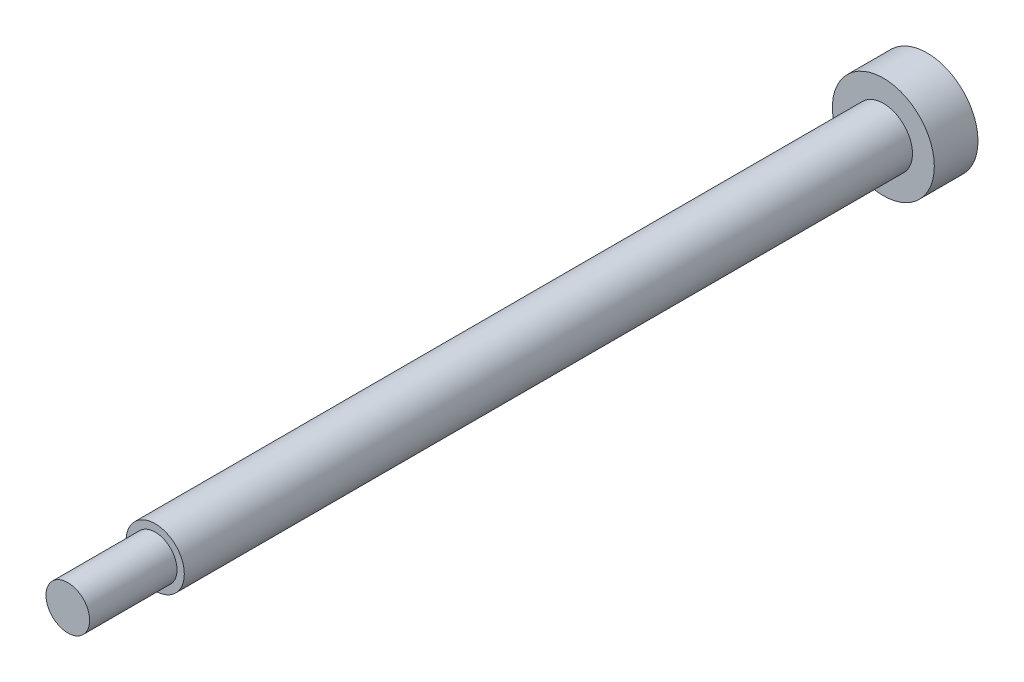
ISO-10303-21;
HEADER;
FILE_DESCRIPTION(('STEP AP214'),'2;1');
FILE_NAME('part.step','',(''),(''),'','','');
FILE_SCHEMA(('AUTOMOTIVE_DESIGN { 1 0 10303 214 1 1 1 1 }'));
ENDSEC;
DATA;
#1=APPLICATION_CONTEXT('core data for automotive mechanical design processes');
#2=APPLICATION_PROTOCOL_DEFINITION('international standard','automotive_design',2000,#1);
#3=PRODUCT_CONTEXT('',#1,'mechanical');
#4=PRODUCT('Part','Part','',(#3));
#5=PRODUCT_RELATED_PRODUCT_CATEGORY('part','',(#4));
#6=PRODUCT_DEFINITION_FORMATION('','',#4);
#7=PRODUCT_DEFINITION_CONTEXT('part definition',#1,'design');
#8=PRODUCT_DEFINITION('design','',#6,#7);
#9=PRODUCT_DEFINITION_SHAPE('','',#8);
#10=(LENGTH_UNIT() NAMED_UNIT(*) SI_UNIT(.MILLI.,.METRE.));
#11=(NAMED_UNIT(*) PLANE_ANGLE_UNIT() SI_UNIT($,.RADIAN.));
#12=(NAMED_UNIT(*) SI_UNIT($,.STERADIAN.) SOLID_ANGLE_UNIT());
#13=UNCERTAINTY_MEASURE_WITH_UNIT(LENGTH_MEASURE(1.E-05),#10,'distance_accuracy_value','');
#14=(GEOMETRIC_REPRESENTATION_CONTEXT(3) GLOBAL_UNCERTAINTY_ASSIGNED_CONTEXT((#13)) GLOBAL_UNIT_ASSIGNED_CONTEXT((#10,
#11,#12)) REPRESENTATION_CONTEXT('',''));
#15=CARTESIAN_POINT('',(0.,0.,0.));
#16=DIRECTION('',(0.,0.,1.));
#17=DIRECTION('',(1.,0.,0.));
#18=AXIS2_PLACEMENT_3D('',#15,#16,#17);
#19=CARTESIAN_POINT('',(0.,0.,2.));
#20=DIRECTION('',(0.,0.,-1.));
#21=DIRECTION('',(0.,-1.,0.));
#22=AXIS2_PLACEMENT_3D('',#19,#20,#21);
#23=PLANE('',#22);
#24=DIRECTION('',(-0.5,0.866025403784439,0.));
#25=VECTOR('',#24,1.);
#26=CARTESIAN_POINT('',(-0.866025403784439,-1.5,2.));
#27=LINE('',#26,#25);
#28=CARTESIAN_POINT('',(-0.866025403784439,-1.5,2.));
#29=VERTEX_POINT('',#28);
#30=CARTESIAN_POINT('',(-1.73205080756888,0.,2.));
#31=VERTEX_POINT('',#30);
#32=EDGE_CURVE('E96',#29,#31,#27,.T.);
#33=ORIENTED_EDGE('',*,*,#32,.T.);
#34=DIRECTION('',(0.5,0.866025403784439,0.));
#35=VECTOR('',#34,1.);
#36=CARTESIAN_POINT('',(-1.73205080756888,0.,2.));
#37=LINE('',#36,#35);
#38=CARTESIAN_POINT('',(-0.866025403784438,1.5,2.));
#39=VERTEX_POINT('',#38);
#40=EDGE_CURVE('E11',#31,#39,#37,.T.);
#41=ORIENTED_EDGE('',*,*,#40,.T.);
#42=DIRECTION('',(1.,0.,0.));
#43=VECTOR('',#42,1.);
#44=CARTESIAN_POINT('',(-0.866025403784438,1.5,2.));
#45=LINE('',#44,#43);
#46=CARTESIAN_POINT('',(0.866025403784439,1.5,2.));
#47=VERTEX_POINT('',#46);
#48=EDGE_CURVE('E44',#39,#47,#45,.T.);
#49=ORIENTED_EDGE('',*,*,#48,.T.);
#50=DIRECTION('',(0.5,-0.866025403784439,0.));
#51=VECTOR('',#50,1.);
#52=CARTESIAN_POINT('',(0.866025403784439,1.5,2.));
#53=LINE('',#52,#51);
#54=CARTESIAN_POINT('',(1.73205080756888,0.,2.));
#55=VERTEX_POINT('',#54);
#56=EDGE_CURVE('E152',#47,#55,#53,.T.);
#57=ORIENTED_EDGE('',*,*,#56,.T.);
#58=DIRECTION('',(-0.5,-0.866025403784439,0.));
#59=VECTOR('',#58,1.);
#60=CARTESIAN_POINT('',(1.73205080756888,0.,2.));
#61=LINE('',#60,#59);
#62=CARTESIAN_POINT('',(0.866025403784439,-1.5,2.));
#63=VERTEX_POINT('',#62);
#64=EDGE_CURVE('E149',#55,#63,#61,.T.);
#65=ORIENTED_EDGE('',*,*,#64,.T.);
#66=DIRECTION('',(-1.,0.,0.));
#67=VECTOR('',#66,1.);
#68=CARTESIAN_POINT('',(0.866025403784439,-1.5,2.));
#69=LINE('',#68,#67);
#70=EDGE_CURVE('E100',#63,#29,#69,.T.);
#71=ORIENTED_EDGE('',*,*,#70,.T.);
#72=EDGE_LOOP('',(#33,#41,#49,#57,#65,#71));
#73=FACE_BOUND('',#72,.T.);
#74=ADVANCED_FACE('F17',(#73),#23,.T.);
#75=CARTESIAN_POINT('',(-1.73205080756888,0.,2.));
#76=DIRECTION('',(-0.866025403784439,0.5,0.));
#77=DIRECTION('',(0.,0.,1.));
#78=AXIS2_PLACEMENT_3D('',#75,#76,#77);
#79=PLANE('',#78);
#80=DIRECTION('',(0.5,0.866025403784439,0.));
#81=VECTOR('',#80,1.);
#82=CARTESIAN_POINT('',(-1.73205080756888,0.,0.));
#83=LINE('',#82,#81);
#84=CARTESIAN_POINT('',(-1.73205080756887,0.,0.));
#85=VERTEX_POINT('',#84);
#86=CARTESIAN_POINT('',(-0.866025403784438,1.5,0.));
#87=VERTEX_POINT('',#86);
#88=EDGE_CURVE('E117',#85,#87,#83,.T.);
#89=ORIENTED_EDGE('',*,*,#88,.T.);
#90=DIRECTION('',(0.,0.,-1.));
#91=VECTOR('',#90,1.);
#92=CARTESIAN_POINT('',(-0.866025403784438,1.5,2.));
#93=LINE('',#92,#91);
#94=EDGE_CURVE('E25',#39,#87,#93,.T.);
#95=ORIENTED_EDGE('',*,*,#94,.F.);
#96=ORIENTED_EDGE('',*,*,#40,.F.);
#97=DIRECTION('',(0.,0.,-1.));
#98=VECTOR('',#97,1.);
#99=CARTESIAN_POINT('',(-1.73205080756888,0.,2.));
#100=LINE('',#99,#98);
#101=EDGE_CURVE('E140',#31,#85,#100,.T.);
#102=ORIENTED_EDGE('',*,*,#101,.T.);
#103=EDGE_LOOP('',(#89,#95,#96,#102));
#104=FACE_BOUND('',#103,.T.);
#105=ADVANCED_FACE('F207',(#104),#79,.F.);
#106=CARTESIAN_POINT('',(-0.866025403784438,1.5,2.));
#107=DIRECTION('',(0.,1.,0.));
#108=DIRECTION('',(1.,0.,0.));
#109=AXIS2_PLACEMENT_3D('',#106,#107,#108);
#110=PLANE('',#109);
#111=DIRECTION('',(1.,0.,0.));
#112=VECTOR('',#111,1.);
#113=CARTESIAN_POINT('',(-0.866025403784438,1.5,0.));
#114=LINE('',#113,#112);
#115=CARTESIAN_POINT('',(0.866025403784439,1.5,0.));
#116=VERTEX_POINT('',#115);
#117=EDGE_CURVE('E136',#87,#116,#114,.T.);
#118=ORIENTED_EDGE('',*,*,#117,.T.);
#119=DIRECTION('',(0.,0.,-1.));
#120=VECTOR('',#119,1.);
#121=CARTESIAN_POINT('',(0.866025403784439,1.5,2.));
#122=LINE('',#121,#120);
#123=EDGE_CURVE('E155',#47,#116,#122,.T.);
#124=ORIENTED_EDGE('',*,*,#123,.F.);
#125=ORIENTED_EDGE('',*,*,#48,.F.);
#126=ORIENTED_EDGE('',*,*,#94,.T.);
#127=EDGE_LOOP('',(#118,#124,#125,#126));
#128=FACE_BOUND('',#127,.T.);
#129=ADVANCED_FACE('F211',(#128),#110,.F.);
#130=CARTESIAN_POINT('',(0.866025403784439,1.5,2.));
#131=DIRECTION('',(0.866025403784439,0.5,0.));
#132=DIRECTION('',(0.,0.,-1.));
#133=AXIS2_PLACEMENT_3D('',#130,#131,#132);
#134=PLANE('',#133);
#135=DIRECTION('',(0.5,-0.866025403784439,0.));
#136=VECTOR('',#135,1.);
#137=CARTESIAN_POINT('',(0.866025403784439,1.5,0.));
#138=LINE('',#137,#136);
#139=CARTESIAN_POINT('',(1.73205080756888,0.,0.));
#140=VERTEX_POINT('',#139);
#141=EDGE_CURVE('E132',#116,#140,#138,.T.);
#142=ORIENTED_EDGE('',*,*,#141,.T.);
#143=DIRECTION('',(0.,0.,-1.));
#144=VECTOR('',#143,1.);
#145=CARTESIAN_POINT('',(1.73205080756888,0.,2.));
#146=LINE('',#145,#144);
#147=EDGE_CURVE('E127',#55,#140,#146,.T.);
#148=ORIENTED_EDGE('',*,*,#147,.F.);
#149=ORIENTED_EDGE('',*,*,#56,.F.);
#150=ORIENTED_EDGE('',*,*,#123,.T.);
#151=EDGE_LOOP('',(#142,#148,#149,#150));
#152=FACE_BOUND('',#151,.T.);
#153=ADVANCED_FACE('F218',(#152),#134,.F.);
#154=CARTESIAN_POINT('',(1.73205080756888,0.,2.));
#155=DIRECTION('',(0.866025403784439,-0.5,0.));
#156=DIRECTION('',(0.,0.,-1.));
#157=AXIS2_PLACEMENT_3D('',#154,#155,#156);
#158=PLANE('',#157);
#159=DIRECTION('',(-0.5,-0.866025403784439,0.));
#160=VECTOR('',#159,1.);
#161=CARTESIAN_POINT('',(1.73205080756888,0.,0.));
#162=LINE('',#161,#160);
#163=CARTESIAN_POINT('',(0.866025403784439,-1.5,0.));
#164=VERTEX_POINT('',#163);
#165=EDGE_CURVE('E111',#140,#164,#162,.T.);
#166=ORIENTED_EDGE('',*,*,#165,.T.);
#167=DIRECTION('',(0.,0.,-1.));
#168=VECTOR('',#167,1.);
#169=CARTESIAN_POINT('',(0.866025403784439,-1.5,2.));
#170=LINE('',#169,#168);
#171=EDGE_CURVE('E106',#63,#164,#170,.T.);
#172=ORIENTED_EDGE('',*,*,#171,.F.);
#173=ORIENTED_EDGE('',*,*,#64,.F.);
#174=ORIENTED_EDGE('',*,*,#147,.T.);
#175=EDGE_LOOP('',(#166,#172,#173,#174));
#176=FACE_BOUND('',#175,.T.);
#177=ADVANCED_FACE('F221',(#176),#158,.F.);
#178=CARTESIAN_POINT('',(0.866025403784439,-1.5,2.));
#179=DIRECTION('',(0.,-1.,0.));
#180=DIRECTION('',(0.,0.,-1.));
#181=AXIS2_PLACEMENT_3D('',#178,#179,#180);
#182=PLANE('',#181);
#183=DIRECTION('',(-1.,0.,0.));
#184=VECTOR('',#183,1.);
#185=CARTESIAN_POINT('',(0.866025403784439,-1.5,0.));
#186=LINE('',#185,#184);
#187=CARTESIAN_POINT('',(-0.866025403784439,-1.5,0.));
#188=VERTEX_POINT('',#187);
#189=EDGE_CURVE('E103',#164,#188,#186,.T.);
#190=ORIENTED_EDGE('',*,*,#189,.T.);
#191=DIRECTION('',(0.,0.,-1.));
#192=VECTOR('',#191,1.);
#193=CARTESIAN_POINT('',(-0.866025403784439,-1.5,2.));
#194=LINE('',#193,#192);
#195=EDGE_CURVE('E89',#29,#188,#194,.T.);
#196=ORIENTED_EDGE('',*,*,#195,.F.);
#197=ORIENTED_EDGE('',*,*,#70,.F.);
#198=ORIENTED_EDGE('',*,*,#171,.T.);
#199=EDGE_LOOP('',(#190,#196,#197,#198));
#200=FACE_BOUND('',#199,.T.);
#201=ADVANCED_FACE('F104',(#200),#182,.F.);
#202=CARTESIAN_POINT('',(-0.866025403784439,-1.5,2.));
#203=DIRECTION('',(-0.866025403784439,-0.5,0.));
#204=DIRECTION('',(-0.5,0.866025403784439,0.));
#205=AXIS2_PLACEMENT_3D('',#202,#203,#204);
#206=PLANE('',#205);
#207=DIRECTION('',(-0.5,0.866025403784439,0.));
#208=VECTOR('',#207,1.);
#209=CARTESIAN_POINT('',(-0.866025403784439,-1.5,0.));
#210=LINE('',#209,#208);
#211=EDGE_CURVE('E94',#188,#85,#210,.T.);
#212=ORIENTED_EDGE('',*,*,#211,.T.);
#213=ORIENTED_EDGE('',*,*,#101,.F.);
#214=ORIENTED_EDGE('',*,*,#32,.F.);
#215=ORIENTED_EDGE('',*,*,#195,.T.);
#216=EDGE_LOOP('',(#212,#213,#214,#215));
#217=FACE_BOUND('',#216,.T.);
#218=ADVANCED_FACE('F91',(#217),#206,.F.);
#219=CARTESIAN_POINT('',(0.,0.,59.));
#220=DIRECTION('',(0.,0.,1.));
#221=DIRECTION('',(1.,0.,0.));
#222=AXIS2_PLACEMENT_3D('',#219,#220,#221);
#223=PLANE('',#222);
#224=CARTESIAN_POINT('',(0.,0.,59.));
#225=DIRECTION('',(0.,0.,1.));
#226=DIRECTION('',(1.,0.,0.));
#227=AXIS2_PLACEMENT_3D('',#224,#225,#226);
#228=CIRCLE('',#227,1.5);
#229=CARTESIAN_POINT('',(1.5,0.,59.));
#230=VERTEX_POINT('',#229);
#231=EDGE_CURVE('E182',#230,#230,#228,.T.);
#232=ORIENTED_EDGE('',*,*,#231,.T.);
#233=EDGE_LOOP('',(#232));
#234=FACE_BOUND('',#233,.T.);
#235=ADVANCED_FACE('F192',(#234),#223,.T.);
#236=CARTESIAN_POINT('',(0.,0.,53.));
#237=DIRECTION('',(0.,0.,1.));
#238=DIRECTION('',(1.,0.,0.));
#239=AXIS2_PLACEMENT_3D('',#236,#237,#238);
#240=PLANE('',#239);
#241=CARTESIAN_POINT('',(0.,0.,53.));
#242=DIRECTION('',(0.,0.,1.));
#243=DIRECTION('',(1.,0.,0.));
#244=AXIS2_PLACEMENT_3D('',#241,#242,#243);
#245=CIRCLE('',#244,1.5);
#246=CARTESIAN_POINT('',(1.5,0.,53.));
#247=VERTEX_POINT('',#246);
#248=EDGE_CURVE('E177',#247,#247,#245,.T.);
#249=ORIENTED_EDGE('',*,*,#248,.F.);
#250=EDGE_LOOP('',(#249));
#251=FACE_BOUND('',#250,.T.);
#252=CARTESIAN_POINT('',(0.,0.,53.));
#253=DIRECTION('',(0.,0.,1.));
#254=DIRECTION('',(1.,0.,0.));
#255=AXIS2_PLACEMENT_3D('',#252,#253,#254);
#256=CIRCLE('',#255,2.);
#257=CARTESIAN_POINT('',(2.,0.,53.));
#258=VERTEX_POINT('',#257);
#259=EDGE_CURVE('E174',#258,#258,#256,.T.);
#260=ORIENTED_EDGE('',*,*,#259,.T.);
#261=EDGE_LOOP('',(#260));
#262=FACE_BOUND('',#261,.T.);
#263=ADVANCED_FACE('F294',(#251,#262),#240,.T.);
#264=CARTESIAN_POINT('',(0.,0.,0.));
#265=DIRECTION('',(0.,0.,1.));
#266=DIRECTION('',(1.,0.,0.));
#267=AXIS2_PLACEMENT_3D('',#264,#265,#266);
#268=PLANE('',#267);
#269=ORIENTED_EDGE('',*,*,#88,.F.);
#270=ORIENTED_EDGE('',*,*,#211,.F.);
#271=ORIENTED_EDGE('',*,*,#189,.F.);
#272=ORIENTED_EDGE('',*,*,#165,.F.);
#273=ORIENTED_EDGE('',*,*,#141,.F.);
#274=ORIENTED_EDGE('',*,*,#117,.F.);
#275=EDGE_LOOP('',(#269,#270,#271,#272,#273,#274));
#276=FACE_BOUND('',#275,.T.);
#277=CARTESIAN_POINT('',(0.,0.,0.));
#278=DIRECTION('',(0.,0.,1.));
#279=DIRECTION('',(1.,0.,0.));
#280=AXIS2_PLACEMENT_3D('',#277,#278,#279);
#281=CIRCLE('',#280,3.5);
#282=CARTESIAN_POINT('',(3.5,0.,0.));
#283=VERTEX_POINT('',#282);
#284=EDGE_CURVE('E124',#283,#283,#281,.T.);
#285=ORIENTED_EDGE('',*,*,#284,.F.);
#286=EDGE_LOOP('',(#285));
#287=FACE_BOUND('',#286,.T.);
#288=ADVANCED_FACE('F113',(#276,#287),#268,.F.);
#289=CARTESIAN_POINT('',(0.,0.,3.));
#290=DIRECTION('',(0.,0.,1.));
#291=DIRECTION('',(1.,0.,0.));
#292=AXIS2_PLACEMENT_3D('',#289,#290,#291);
#293=PLANE('',#292);
#294=CARTESIAN_POINT('',(0.,0.,3.));
#295=DIRECTION('',(0.,0.,1.));
#296=DIRECTION('',(1.,0.,0.));
#297=AXIS2_PLACEMENT_3D('',#294,#295,#296);
#298=CIRCLE('',#297,2.);
#299=CARTESIAN_POINT('',(2.,0.,3.));
#300=VERTEX_POINT('',#299);
#301=EDGE_CURVE('E170',#300,#300,#298,.T.);
#302=ORIENTED_EDGE('',*,*,#301,.F.);
#303=EDGE_LOOP('',(#302));
#304=FACE_BOUND('',#303,.T.);
#305=CARTESIAN_POINT('',(0.,0.,3.));
#306=DIRECTION('',(0.,0.,1.));
#307=DIRECTION('',(1.,0.,0.));
#308=AXIS2_PLACEMENT_3D('',#305,#306,#307);
#309=CIRCLE('',#308,3.5);
#310=CARTESIAN_POINT('',(3.5,0.,3.));
#311=VERTEX_POINT('',#310);
#312=EDGE_CURVE('E169',#311,#311,#309,.T.);
#313=ORIENTED_EDGE('',*,*,#312,.T.);
#314=EDGE_LOOP('',(#313));
#315=FACE_BOUND('',#314,.T.);
#316=ADVANCED_FACE('F288',(#304,#315),#293,.T.);
#317=CARTESIAN_POINT('',(0.,0.,3.));
#318=DIRECTION('',(0.,0.,-1.));
#319=DIRECTION('',(-1.,0.,0.));
#320=AXIS2_PLACEMENT_3D('',#317,#318,#319);
#321=CYLINDRICAL_SURFACE('',#320,3.5);
#322=ORIENTED_EDGE('',*,*,#284,.T.);
#323=EDGE_LOOP('',(#322));
#324=FACE_BOUND('',#323,.T.);
#325=ORIENTED_EDGE('',*,*,#312,.F.);
#326=EDGE_LOOP('',(#325));
#327=FACE_BOUND('',#326,.T.);
#328=ADVANCED_FACE('F203',(#324,#327),#321,.T.);
#329=CARTESIAN_POINT('',(0.,0.,53.));
#330=DIRECTION('',(0.,0.,-1.));
#331=DIRECTION('',(-1.,0.,0.));
#332=AXIS2_PLACEMENT_3D('',#329,#330,#331);
#333=CYLINDRICAL_SURFACE('',#332,2.);
#334=ORIENTED_EDGE('',*,*,#301,.T.);
#335=EDGE_LOOP('',(#334));
#336=FACE_BOUND('',#335,.T.);
#337=ORIENTED_EDGE('',*,*,#259,.F.);
#338=EDGE_LOOP('',(#337));
#339=FACE_BOUND('',#338,.T.);
#340=ADVANCED_FACE('F196',(#336,#339),#333,.T.);
#341=CARTESIAN_POINT('',(0.,0.,59.));
#342=DIRECTION('',(0.,0.,-1.));
#343=DIRECTION('',(-1.,0.,0.));
#344=AXIS2_PLACEMENT_3D('',#341,#342,#343);
#345=CYLINDRICAL_SURFACE('',#344,1.5);
#346=ORIENTED_EDGE('',*,*,#248,.T.);
#347=EDGE_LOOP('',(#346));
#348=FACE_BOUND('',#347,.T.);
#349=ORIENTED_EDGE('',*,*,#231,.F.);
#350=EDGE_LOOP('',(#349));
#351=FACE_BOUND('',#350,.T.);
#352=ADVANCED_FACE('F194',(#348,#351),#345,.T.);
#353=CLOSED_SHELL('',(#74,#105,#129,#153,#177,#201,#218,#235,#263,#288,#316,#328,#340,#352));
#354=MANIFOLD_SOLID_BREP('B1',#353);
#355=ADVANCED_BREP_SHAPE_REPRESENTATION('',(#18,#354),#14);
#356=SHAPE_DEFINITION_REPRESENTATION(#9,#355);
ENDSEC;
END-ISO-10303-21;
